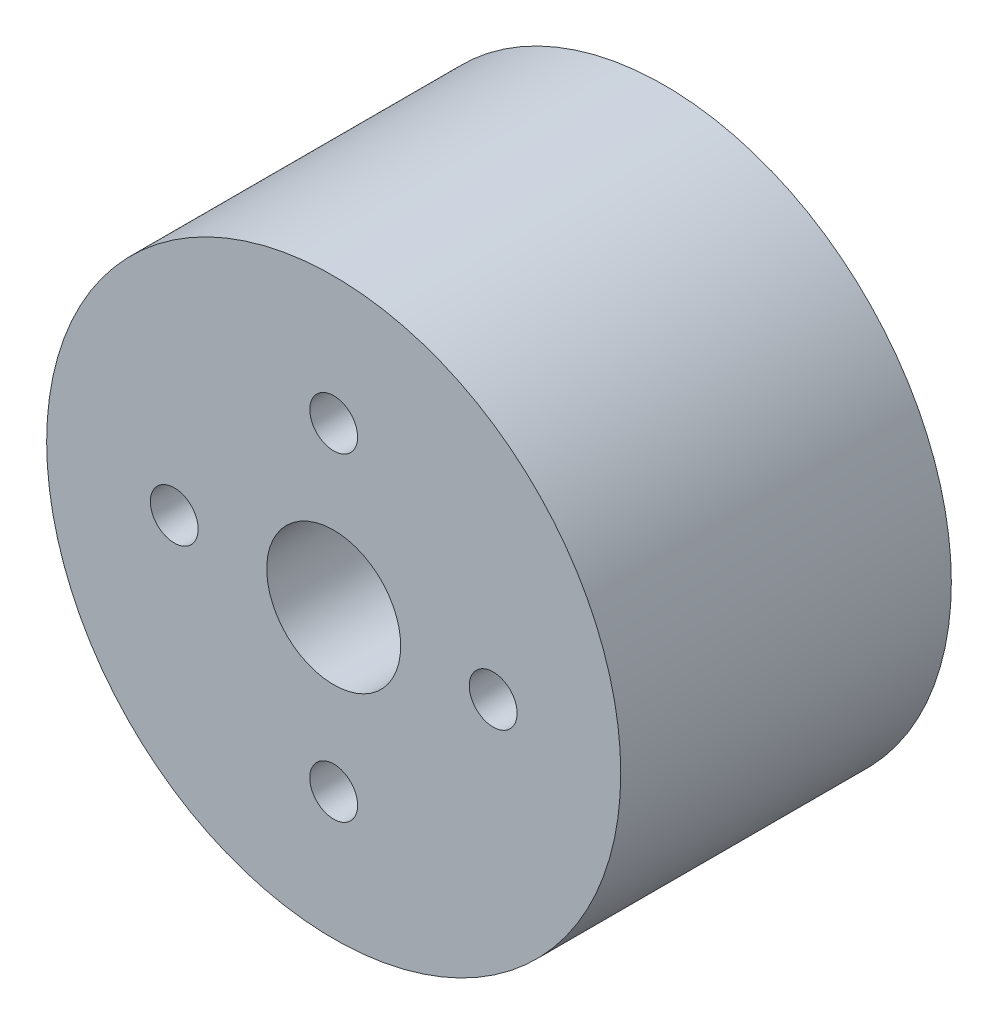
ISO-10303-21;
HEADER;
FILE_DESCRIPTION(('STEP AP214'),'2;1');
FILE_NAME('part.step','',(''),(''),'','','');
FILE_SCHEMA(('AUTOMOTIVE_DESIGN { 1 0 10303 214 1 1 1 1 }'));
ENDSEC;
DATA;
#1=APPLICATION_CONTEXT('core data for automotive mechanical design processes');
#2=APPLICATION_PROTOCOL_DEFINITION('international standard','automotive_design',2000,#1);
#3=PRODUCT_CONTEXT('',#1,'mechanical');
#4=PRODUCT('Part','Part','',(#3));
#5=PRODUCT_RELATED_PRODUCT_CATEGORY('part','',(#4));
#6=PRODUCT_DEFINITION_FORMATION('','',#4);
#7=PRODUCT_DEFINITION_CONTEXT('part definition',#1,'design');
#8=PRODUCT_DEFINITION('design','',#6,#7);
#9=PRODUCT_DEFINITION_SHAPE('','',#8);
#10=(LENGTH_UNIT() NAMED_UNIT(*) SI_UNIT(.MILLI.,.METRE.));
#11=(NAMED_UNIT(*) PLANE_ANGLE_UNIT() SI_UNIT($,.RADIAN.));
#12=(NAMED_UNIT(*) SI_UNIT($,.STERADIAN.) SOLID_ANGLE_UNIT());
#13=UNCERTAINTY_MEASURE_WITH_UNIT(LENGTH_MEASURE(1.E-05),#10,'distance_accuracy_value','');
#14=(GEOMETRIC_REPRESENTATION_CONTEXT(3) GLOBAL_UNCERTAINTY_ASSIGNED_CONTEXT((#13)) GLOBAL_UNIT_ASSIGNED_CONTEXT((#10,
#11,#12)) REPRESENTATION_CONTEXT('',''));
#15=CARTESIAN_POINT('',(0.,0.,0.));
#16=DIRECTION('',(0.,0.,1.));
#17=DIRECTION('',(1.,0.,0.));
#18=AXIS2_PLACEMENT_3D('',#15,#16,#17);
#19=CARTESIAN_POINT('',(0.,0.,20.73));
#20=DIRECTION('',(0.,0.,1.));
#21=DIRECTION('',(1.,0.,0.));
#22=AXIS2_PLACEMENT_3D('',#19,#20,#21);
#23=PLANE('',#22);
#24=CARTESIAN_POINT('',(2.8176792204172E-13,-10.,20.73));
#25=DIRECTION('',(0.,0.,1.));
#26=DIRECTION('',(1.,0.,0.));
#27=AXIS2_PLACEMENT_3D('',#24,#25,#26);
#28=CIRCLE('',#27,1.50000000000034);
#29=CARTESIAN_POINT('',(1.50000000000062,-10.,20.73));
#30=VERTEX_POINT('',#29);
#31=EDGE_CURVE('E59',#30,#30,#28,.T.);
#32=ORIENTED_EDGE('',*,*,#31,.F.);
#33=EDGE_LOOP('',(#32));
#34=FACE_BOUND('',#33,.T.);
#35=CARTESIAN_POINT('',(0.,0.,20.73));
#36=DIRECTION('',(0.,0.,1.));
#37=DIRECTION('',(1.,0.,0.));
#38=AXIS2_PLACEMENT_3D('',#35,#36,#37);
#39=CIRCLE('',#38,4.2);
#40=CARTESIAN_POINT('',(4.2,0.,20.73));
#41=VERTEX_POINT('',#40);
#42=EDGE_CURVE('E47',#41,#41,#39,.T.);
#43=ORIENTED_EDGE('',*,*,#42,.F.);
#44=EDGE_LOOP('',(#43));
#45=FACE_BOUND('',#44,.T.);
#46=CARTESIAN_POINT('',(0.,0.,20.73));
#47=DIRECTION('',(0.,0.,1.));
#48=DIRECTION('',(1.,0.,0.));
#49=AXIS2_PLACEMENT_3D('',#46,#47,#48);
#50=CIRCLE('',#49,18.);
#51=CARTESIAN_POINT('',(18.,0.,20.73));
#52=VERTEX_POINT('',#51);
#53=EDGE_CURVE('E10',#52,#52,#50,.T.);
#54=ORIENTED_EDGE('',*,*,#53,.T.);
#55=EDGE_LOOP('',(#54));
#56=FACE_BOUND('',#55,.T.);
#57=CARTESIAN_POINT('',(0.,10.,20.73));
#58=DIRECTION('',(0.,0.,1.));
#59=DIRECTION('',(1.,0.,0.));
#60=AXIS2_PLACEMENT_3D('',#57,#58,#59);
#61=CIRCLE('',#60,1.5);
#62=CARTESIAN_POINT('',(1.5,10.,20.73));
#63=VERTEX_POINT('',#62);
#64=EDGE_CURVE('E42',#63,#63,#61,.T.);
#65=ORIENTED_EDGE('',*,*,#64,.F.);
#66=EDGE_LOOP('',(#65));
#67=FACE_BOUND('',#66,.T.);
#68=CARTESIAN_POINT('',(10.,0.,20.73));
#69=DIRECTION('',(0.,0.,1.));
#70=DIRECTION('',(1.,0.,0.));
#71=AXIS2_PLACEMENT_3D('',#68,#69,#70);
#72=CIRCLE('',#71,1.5);
#73=CARTESIAN_POINT('',(11.5,0.,20.73));
#74=VERTEX_POINT('',#73);
#75=EDGE_CURVE('E53',#74,#74,#72,.T.);
#76=ORIENTED_EDGE('',*,*,#75,.F.);
#77=EDGE_LOOP('',(#76));
#78=FACE_BOUND('',#77,.T.);
#79=CARTESIAN_POINT('',(-9.99999999999986,-1.39659314221713E-13,20.73));
#80=DIRECTION('',(0.,0.,1.));
#81=DIRECTION('',(1.,0.,0.));
#82=AXIS2_PLACEMENT_3D('',#79,#80,#81);
#83=CIRCLE('',#82,1.50000000000027);
#84=CARTESIAN_POINT('',(-8.49999999999959,-1.39659314221713E-13,20.73));
#85=VERTEX_POINT('',#84);
#86=EDGE_CURVE('E65',#85,#85,#83,.T.);
#87=ORIENTED_EDGE('',*,*,#86,.F.);
#88=EDGE_LOOP('',(#87));
#89=FACE_BOUND('',#88,.T.);
#90=ADVANCED_FACE('F31',(#34,#45,#56,#67,#78,#89),#23,.T.);
#91=CARTESIAN_POINT('',(0.,0.,0.));
#92=DIRECTION('',(0.,0.,1.));
#93=DIRECTION('',(1.,0.,0.));
#94=AXIS2_PLACEMENT_3D('',#91,#92,#93);
#95=PLANE('',#94);
#96=CARTESIAN_POINT('',(2.8176792204172E-13,-10.,0.));
#97=DIRECTION('',(0.,0.,1.));
#98=DIRECTION('',(1.,0.,0.));
#99=AXIS2_PLACEMENT_3D('',#96,#97,#98);
#100=CIRCLE('',#99,1.50000000000034);
#101=CARTESIAN_POINT('',(1.50000000000062,-10.,0.));
#102=VERTEX_POINT('',#101);
#103=EDGE_CURVE('E62',#102,#102,#100,.T.);
#104=ORIENTED_EDGE('',*,*,#103,.T.);
#105=EDGE_LOOP('',(#104));
#106=FACE_BOUND('',#105,.T.);
#107=CARTESIAN_POINT('',(0.,0.,0.));
#108=DIRECTION('',(0.,0.,1.));
#109=DIRECTION('',(1.,0.,0.));
#110=AXIS2_PLACEMENT_3D('',#107,#108,#109);
#111=CIRCLE('',#110,4.2);
#112=CARTESIAN_POINT('',(4.2,0.,0.));
#113=VERTEX_POINT('',#112);
#114=EDGE_CURVE('E50',#113,#113,#111,.T.);
#115=ORIENTED_EDGE('',*,*,#114,.T.);
#116=EDGE_LOOP('',(#115));
#117=FACE_BOUND('',#116,.T.);
#118=CARTESIAN_POINT('',(0.,0.,0.));
#119=DIRECTION('',(0.,0.,1.));
#120=DIRECTION('',(1.,0.,0.));
#121=AXIS2_PLACEMENT_3D('',#118,#119,#120);
#122=CIRCLE('',#121,18.);
#123=CARTESIAN_POINT('',(18.,0.,0.));
#124=VERTEX_POINT('',#123);
#125=EDGE_CURVE('E35',#124,#124,#122,.T.);
#126=ORIENTED_EDGE('',*,*,#125,.F.);
#127=EDGE_LOOP('',(#126));
#128=FACE_BOUND('',#127,.T.);
#129=CARTESIAN_POINT('',(0.,10.,0.));
#130=DIRECTION('',(0.,0.,1.));
#131=DIRECTION('',(1.,0.,0.));
#132=AXIS2_PLACEMENT_3D('',#129,#130,#131);
#133=CIRCLE('',#132,1.5);
#134=CARTESIAN_POINT('',(1.5,10.,0.));
#135=VERTEX_POINT('',#134);
#136=EDGE_CURVE('E44',#135,#135,#133,.T.);
#137=ORIENTED_EDGE('',*,*,#136,.T.);
#138=EDGE_LOOP('',(#137));
#139=FACE_BOUND('',#138,.T.);
#140=CARTESIAN_POINT('',(10.,0.,0.));
#141=DIRECTION('',(0.,0.,1.));
#142=DIRECTION('',(1.,0.,0.));
#143=AXIS2_PLACEMENT_3D('',#140,#141,#142);
#144=CIRCLE('',#143,1.5);
#145=CARTESIAN_POINT('',(11.5,0.,0.));
#146=VERTEX_POINT('',#145);
#147=EDGE_CURVE('E56',#146,#146,#144,.T.);
#148=ORIENTED_EDGE('',*,*,#147,.T.);
#149=EDGE_LOOP('',(#148));
#150=FACE_BOUND('',#149,.T.);
#151=CARTESIAN_POINT('',(-9.99999999999986,-1.39659314221713E-13,0.));
#152=DIRECTION('',(0.,0.,1.));
#153=DIRECTION('',(1.,0.,0.));
#154=AXIS2_PLACEMENT_3D('',#151,#152,#153);
#155=CIRCLE('',#154,1.50000000000027);
#156=CARTESIAN_POINT('',(-8.49999999999959,-1.39659314221713E-13,0.));
#157=VERTEX_POINT('',#156);
#158=EDGE_CURVE('E68',#157,#157,#155,.T.);
#159=ORIENTED_EDGE('',*,*,#158,.T.);
#160=EDGE_LOOP('',(#159));
#161=FACE_BOUND('',#160,.T.);
#162=ADVANCED_FACE('F78',(#106,#117,#128,#139,#150,#161),#95,.F.);
#163=CARTESIAN_POINT('',(0.,0.,20.73));
#164=DIRECTION('',(0.,0.,-1.));
#165=DIRECTION('',(-1.,0.,0.));
#166=AXIS2_PLACEMENT_3D('',#163,#164,#165);
#167=CYLINDRICAL_SURFACE('',#166,18.);
#168=ORIENTED_EDGE('',*,*,#53,.F.);
#169=EDGE_LOOP('',(#168));
#170=FACE_BOUND('',#169,.T.);
#171=ORIENTED_EDGE('',*,*,#125,.T.);
#172=EDGE_LOOP('',(#171));
#173=FACE_BOUND('',#172,.T.);
#174=ADVANCED_FACE('F33',(#170,#173),#167,.T.);
#175=CARTESIAN_POINT('',(0.,10.,20.73));
#176=DIRECTION('',(0.,0.,-1.));
#177=DIRECTION('',(-1.,0.,0.));
#178=AXIS2_PLACEMENT_3D('',#175,#176,#177);
#179=CYLINDRICAL_SURFACE('',#178,1.5);
#180=ORIENTED_EDGE('',*,*,#64,.T.);
#181=EDGE_LOOP('',(#180));
#182=FACE_BOUND('',#181,.T.);
#183=ORIENTED_EDGE('',*,*,#136,.F.);
#184=EDGE_LOOP('',(#183));
#185=FACE_BOUND('',#184,.T.);
#186=ADVANCED_FACE('F88',(#182,#185),#179,.F.);
#187=CARTESIAN_POINT('',(0.,0.,20.73));
#188=DIRECTION('',(0.,0.,-1.));
#189=DIRECTION('',(-1.,0.,0.));
#190=AXIS2_PLACEMENT_3D('',#187,#188,#189);
#191=CYLINDRICAL_SURFACE('',#190,4.2);
#192=ORIENTED_EDGE('',*,*,#42,.T.);
#193=EDGE_LOOP('',(#192));
#194=FACE_BOUND('',#193,.T.);
#195=ORIENTED_EDGE('',*,*,#114,.F.);
#196=EDGE_LOOP('',(#195));
#197=FACE_BOUND('',#196,.T.);
#198=ADVANCED_FACE('F91',(#194,#197),#191,.F.);
#199=CARTESIAN_POINT('',(10.,0.,20.73));
#200=DIRECTION('',(0.,0.,-1.));
#201=DIRECTION('',(-1.,0.,0.));
#202=AXIS2_PLACEMENT_3D('',#199,#200,#201);
#203=CYLINDRICAL_SURFACE('',#202,1.5);
#204=ORIENTED_EDGE('',*,*,#75,.T.);
#205=EDGE_LOOP('',(#204));
#206=FACE_BOUND('',#205,.T.);
#207=ORIENTED_EDGE('',*,*,#147,.F.);
#208=EDGE_LOOP('',(#207));
#209=FACE_BOUND('',#208,.T.);
#210=ADVANCED_FACE('F95',(#206,#209),#203,.F.);
#211=CARTESIAN_POINT('',(2.8176792204172E-13,-10.,20.73));
#212=DIRECTION('',(0.,0.,-1.));
#213=DIRECTION('',(-1.,0.,0.));
#214=AXIS2_PLACEMENT_3D('',#211,#212,#213);
#215=CYLINDRICAL_SURFACE('',#214,1.50000000000034);
#216=ORIENTED_EDGE('',*,*,#31,.T.);
#217=EDGE_LOOP('',(#216));
#218=FACE_BOUND('',#217,.T.);
#219=ORIENTED_EDGE('',*,*,#103,.F.);
#220=EDGE_LOOP('',(#219));
#221=FACE_BOUND('',#220,.T.);
#222=ADVANCED_FACE('F99',(#218,#221),#215,.F.);
#223=CARTESIAN_POINT('',(-9.99999999999986,-1.39659314221713E-13,20.73));
#224=DIRECTION('',(0.,0.,-1.));
#225=DIRECTION('',(-1.,0.,0.));
#226=AXIS2_PLACEMENT_3D('',#223,#224,#225);
#227=CYLINDRICAL_SURFACE('',#226,1.50000000000027);
#228=ORIENTED_EDGE('',*,*,#86,.T.);
#229=EDGE_LOOP('',(#228));
#230=FACE_BOUND('',#229,.T.);
#231=ORIENTED_EDGE('',*,*,#158,.F.);
#232=EDGE_LOOP('',(#231));
#233=FACE_BOUND('',#232,.T.);
#234=ADVANCED_FACE('F74',(#230,#233),#227,.F.);
#235=CLOSED_SHELL('',(#90,#162,#174,#186,#198,#210,#222,#234));
#236=MANIFOLD_SOLID_BREP('B2',#235);
#237=ADVANCED_BREP_SHAPE_REPRESENTATION('',(#18,#236),#14);
#238=SHAPE_DEFINITION_REPRESENTATION(#9,#237);
ENDSEC;
END-ISO-10303-21;
